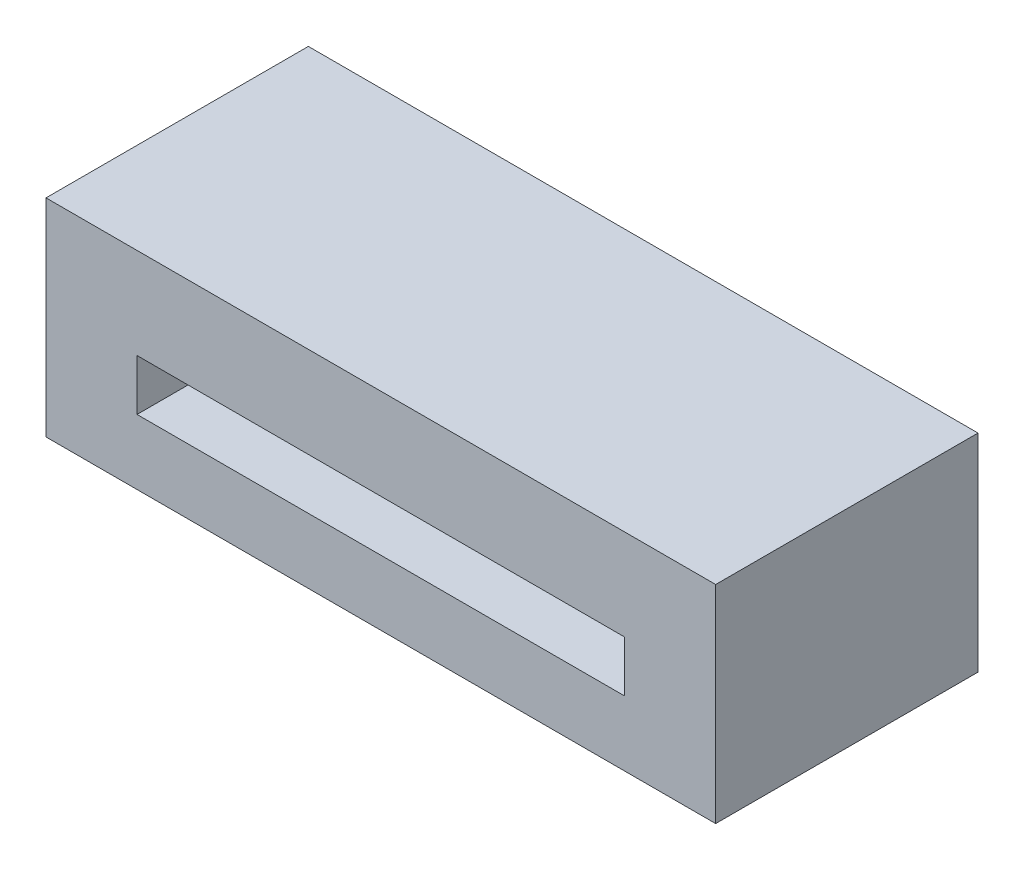
ISO-10303-21;
HEADER;
FILE_DESCRIPTION(('STEP AP214'),'2;1');
FILE_NAME('part.step','',(''),(''),'','','');
FILE_SCHEMA(('AUTOMOTIVE_DESIGN { 1 0 10303 214 1 1 1 1 }'));
ENDSEC;
DATA;
#1=APPLICATION_CONTEXT('core data for automotive mechanical design processes');
#2=APPLICATION_PROTOCOL_DEFINITION('international standard','automotive_design',2000,#1);
#3=PRODUCT_CONTEXT('',#1,'mechanical');
#4=PRODUCT('Part','Part','',(#3));
#5=PRODUCT_RELATED_PRODUCT_CATEGORY('part','',(#4));
#6=PRODUCT_DEFINITION_FORMATION('','',#4);
#7=PRODUCT_DEFINITION_CONTEXT('part definition',#1,'design');
#8=PRODUCT_DEFINITION('design','',#6,#7);
#9=PRODUCT_DEFINITION_SHAPE('','',#8);
#10=(LENGTH_UNIT() NAMED_UNIT(*) SI_UNIT(.MILLI.,.METRE.));
#11=(NAMED_UNIT(*) PLANE_ANGLE_UNIT() SI_UNIT($,.RADIAN.));
#12=(NAMED_UNIT(*) SI_UNIT($,.STERADIAN.) SOLID_ANGLE_UNIT());
#13=UNCERTAINTY_MEASURE_WITH_UNIT(LENGTH_MEASURE(1.E-05),#10,'distance_accuracy_value','');
#14=(GEOMETRIC_REPRESENTATION_CONTEXT(3) GLOBAL_UNCERTAINTY_ASSIGNED_CONTEXT((#13)) GLOBAL_UNIT_ASSIGNED_CONTEXT((#10,
#11,#12)) REPRESENTATION_CONTEXT('',''));
#15=CARTESIAN_POINT('',(0.,0.,0.));
#16=DIRECTION('',(0.,0.,1.));
#17=DIRECTION('',(1.,0.,0.));
#18=AXIS2_PLACEMENT_3D('',#15,#16,#17);
#19=CARTESIAN_POINT('',(0.,-3.57,0.));
#20=DIRECTION('',(0.,1.,0.));
#21=DIRECTION('',(0.,0.,1.));
#22=AXIS2_PLACEMENT_3D('',#19,#20,#21);
#23=PLANE('',#22);
#24=DIRECTION('',(-1.,0.,0.));
#25=VECTOR('',#24,1.);
#26=CARTESIAN_POINT('',(0.,-3.57,-8.07));
#27=LINE('',#26,#25);
#28=CARTESIAN_POINT('',(17.8,-3.57,-8.07));
#29=VERTEX_POINT('',#28);
#30=CARTESIAN_POINT('',(-2.80000000000005,-3.57,-8.07));
#31=VERTEX_POINT('',#30);
#32=EDGE_CURVE('E177',#29,#31,#27,.T.);
#33=ORIENTED_EDGE('',*,*,#32,.F.);
#34=DIRECTION('',(0.,0.,-1.));
#35=VECTOR('',#34,1.);
#36=CARTESIAN_POINT('',(17.8,-3.57,-8.07));
#37=LINE('',#36,#35);
#38=CARTESIAN_POINT('',(17.8000000000001,-3.57,0.));
#39=VERTEX_POINT('',#38);
#40=EDGE_CURVE('E161',#39,#29,#37,.T.);
#41=ORIENTED_EDGE('',*,*,#40,.F.);
#42=DIRECTION('',(1.,0.,0.));
#43=VECTOR('',#42,1.);
#44=CARTESIAN_POINT('',(-2.80000000000006,-3.57,0.));
#45=LINE('',#44,#43);
#46=CARTESIAN_POINT('',(-2.80000000000006,-3.57,0.));
#47=VERTEX_POINT('',#46);
#48=EDGE_CURVE('E183',#47,#39,#45,.T.);
#49=ORIENTED_EDGE('',*,*,#48,.F.);
#50=DIRECTION('',(0.,0.,1.));
#51=VECTOR('',#50,1.);
#52=CARTESIAN_POINT('',(-2.80000000000005,-3.57,-8.07));
#53=LINE('',#52,#51);
#54=EDGE_CURVE('E180',#31,#47,#53,.T.);
#55=ORIENTED_EDGE('',*,*,#54,.F.);
#56=EDGE_LOOP('',(#33,#41,#49,#55));
#57=FACE_BOUND('',#56,.T.);
#58=DIRECTION('',(1.,0.,0.));
#59=VECTOR('',#58,1.);
#60=CARTESIAN_POINT('',(0.,-3.57,-3.60886850650799));
#61=LINE('',#60,#59);
#62=CARTESIAN_POINT('',(6.405,-3.57,-3.60886850650793));
#63=VERTEX_POINT('',#62);
#64=CARTESIAN_POINT('',(8.90499999999999,-3.57,-3.60886850650791));
#65=VERTEX_POINT('',#64);
#66=EDGE_CURVE('E50',#63,#65,#61,.T.);
#67=ORIENTED_EDGE('',*,*,#66,.T.);
#68=DIRECTION('',(0.,0.,-1.));
#69=VECTOR('',#68,1.);
#70=CARTESIAN_POINT('',(8.90499999999999,-3.57,0.));
#71=LINE('',#70,#69);
#72=CARTESIAN_POINT('',(8.90499999999999,-3.57,-7.55386850650791));
#73=VERTEX_POINT('',#72);
#74=EDGE_CURVE('E140',#65,#73,#71,.T.);
#75=ORIENTED_EDGE('',*,*,#74,.T.);
#76=DIRECTION('',(-1.,0.,0.));
#77=VECTOR('',#76,1.);
#78=CARTESIAN_POINT('',(0.,-3.57,-7.55386850650791));
#79=LINE('',#78,#77);
#80=CARTESIAN_POINT('',(6.405,-3.57,-7.55386850650791));
#81=VERTEX_POINT('',#80);
#82=EDGE_CURVE('E126',#73,#81,#79,.T.);
#83=ORIENTED_EDGE('',*,*,#82,.T.);
#84=DIRECTION('',(0.,0.,1.));
#85=VECTOR('',#84,1.);
#86=CARTESIAN_POINT('',(6.405,-3.57,0.));
#87=LINE('',#86,#85);
#88=EDGE_CURVE('E135',#81,#63,#87,.T.);
#89=ORIENTED_EDGE('',*,*,#88,.T.);
#90=EDGE_LOOP('',(#67,#75,#83,#89));
#91=FACE_BOUND('',#90,.T.);
#92=ADVANCED_FACE('F35',(#57,#91),#23,.F.);
#93=CARTESIAN_POINT('',(15.,-1.57,0.));
#94=DIRECTION('',(0.,-1.,0.));
#95=DIRECTION('',(0.,0.,-1.));
#96=AXIS2_PLACEMENT_3D('',#93,#94,#95);
#97=PLANE('',#96);
#98=DIRECTION('',(0.,0.,1.));
#99=VECTOR('',#98,1.);
#100=CARTESIAN_POINT('',(0.,-1.57,0.));
#101=LINE('',#100,#99);
#102=CARTESIAN_POINT('',(0.,-1.57,-8.07));
#103=VERTEX_POINT('',#102);
#104=CARTESIAN_POINT('',(0.,-1.57,0.));
#105=VERTEX_POINT('',#104);
#106=EDGE_CURVE('E147',#103,#105,#101,.T.);
#107=ORIENTED_EDGE('',*,*,#106,.T.);
#108=DIRECTION('',(-1.,0.,0.));
#109=VECTOR('',#108,1.);
#110=CARTESIAN_POINT('',(15.,-1.57,0.));
#111=LINE('',#110,#109);
#112=CARTESIAN_POINT('',(15.,-1.57,0.));
#113=VERTEX_POINT('',#112);
#114=EDGE_CURVE('E157',#113,#105,#111,.T.);
#115=ORIENTED_EDGE('',*,*,#114,.F.);
#116=DIRECTION('',(0.,0.,1.));
#117=VECTOR('',#116,1.);
#118=CARTESIAN_POINT('',(15.,-1.57,0.));
#119=LINE('',#118,#117);
#120=CARTESIAN_POINT('',(15.,-1.57,-8.07));
#121=VERTEX_POINT('',#120);
#122=EDGE_CURVE('E150',#121,#113,#119,.T.);
#123=ORIENTED_EDGE('',*,*,#122,.F.);
#124=DIRECTION('',(-1.,0.,0.));
#125=VECTOR('',#124,1.);
#126=CARTESIAN_POINT('',(15.,-1.57,-8.07));
#127=LINE('',#126,#125);
#128=EDGE_CURVE('E152',#121,#103,#127,.T.);
#129=ORIENTED_EDGE('',*,*,#128,.T.);
#130=EDGE_LOOP('',(#107,#115,#123,#129));
#131=FACE_BOUND('',#130,.T.);
#132=DIRECTION('',(1.,0.,0.));
#133=VECTOR('',#132,1.);
#134=CARTESIAN_POINT('',(15.,-1.57,-3.60886850650785));
#135=LINE('',#134,#133);
#136=CARTESIAN_POINT('',(6.405,-1.57,-3.60886850650793));
#137=VERTEX_POINT('',#136);
#138=CARTESIAN_POINT('',(8.90499999999999,-1.57,-3.60886850650791));
#139=VERTEX_POINT('',#138);
#140=EDGE_CURVE('E11',#137,#139,#135,.T.);
#141=ORIENTED_EDGE('',*,*,#140,.F.);
#142=DIRECTION('',(0.,0.,1.));
#143=VECTOR('',#142,1.);
#144=CARTESIAN_POINT('',(6.405,-1.57,0.));
#145=LINE('',#144,#143);
#146=CARTESIAN_POINT('',(6.405,-1.57,-7.55386850650791));
#147=VERTEX_POINT('',#146);
#148=EDGE_CURVE('E203',#147,#137,#145,.T.);
#149=ORIENTED_EDGE('',*,*,#148,.F.);
#150=DIRECTION('',(-1.,0.,0.));
#151=VECTOR('',#150,1.);
#152=CARTESIAN_POINT('',(15.,-1.57,-7.55386850650791));
#153=LINE('',#152,#151);
#154=CARTESIAN_POINT('',(8.90499999999999,-1.57,-7.55386850650791));
#155=VERTEX_POINT('',#154);
#156=EDGE_CURVE('E129',#155,#147,#153,.T.);
#157=ORIENTED_EDGE('',*,*,#156,.F.);
#158=DIRECTION('',(0.,0.,-1.));
#159=VECTOR('',#158,1.);
#160=CARTESIAN_POINT('',(8.90499999999999,-1.57,0.));
#161=LINE('',#160,#159);
#162=EDGE_CURVE('E43',#139,#155,#161,.T.);
#163=ORIENTED_EDGE('',*,*,#162,.F.);
#164=EDGE_LOOP('',(#141,#149,#157,#163));
#165=FACE_BOUND('',#164,.T.);
#166=ADVANCED_FACE('F221',(#131,#165),#97,.F.);
#167=CARTESIAN_POINT('',(0.,-3.57,0.));
#168=DIRECTION('',(1.,0.,0.));
#169=DIRECTION('',(0.,0.,-1.));
#170=AXIS2_PLACEMENT_3D('',#167,#168,#169);
#171=PLANE('',#170);
#172=DIRECTION('',(0.,1.,0.));
#173=VECTOR('',#172,1.);
#174=CARTESIAN_POINT('',(0.,-3.57,0.));
#175=LINE('',#174,#173);
#176=CARTESIAN_POINT('',(0.,0.,0.));
#177=VERTEX_POINT('',#176);
#178=EDGE_CURVE('E188',#105,#177,#175,.T.);
#179=ORIENTED_EDGE('',*,*,#178,.F.);
#180=ORIENTED_EDGE('',*,*,#106,.F.);
#181=DIRECTION('',(0.,1.,0.));
#182=VECTOR('',#181,1.);
#183=CARTESIAN_POINT('',(0.,-3.57,-8.07));
#184=LINE('',#183,#182);
#185=CARTESIAN_POINT('',(0.,0.,-8.07));
#186=VERTEX_POINT('',#185);
#187=EDGE_CURVE('E185',#103,#186,#184,.T.);
#188=ORIENTED_EDGE('',*,*,#187,.T.);
#189=DIRECTION('',(0.,0.,1.));
#190=VECTOR('',#189,1.);
#191=CARTESIAN_POINT('',(0.,0.,0.));
#192=LINE('',#191,#190);
#193=EDGE_CURVE('E190',#186,#177,#192,.T.);
#194=ORIENTED_EDGE('',*,*,#193,.T.);
#195=EDGE_LOOP('',(#179,#180,#188,#194));
#196=FACE_BOUND('',#195,.T.);
#197=ADVANCED_FACE('F242',(#196),#171,.T.);
#198=CARTESIAN_POINT('',(15.,-3.57,0.));
#199=DIRECTION('',(-1.,0.,0.));
#200=DIRECTION('',(0.,0.,1.));
#201=AXIS2_PLACEMENT_3D('',#198,#199,#200);
#202=PLANE('',#201);
#203=DIRECTION('',(0.,1.,0.));
#204=VECTOR('',#203,1.);
#205=CARTESIAN_POINT('',(15.,-3.57,-8.07));
#206=LINE('',#205,#204);
#207=CARTESIAN_POINT('',(15.,0.,-8.07));
#208=VERTEX_POINT('',#207);
#209=EDGE_CURVE('E170',#121,#208,#206,.T.);
#210=ORIENTED_EDGE('',*,*,#209,.F.);
#211=ORIENTED_EDGE('',*,*,#122,.T.);
#212=DIRECTION('',(0.,1.,0.));
#213=VECTOR('',#212,1.);
#214=CARTESIAN_POINT('',(15.,-3.57,0.));
#215=LINE('',#214,#213);
#216=CARTESIAN_POINT('',(15.,0.,0.));
#217=VERTEX_POINT('',#216);
#218=EDGE_CURVE('E167',#113,#217,#215,.T.);
#219=ORIENTED_EDGE('',*,*,#218,.T.);
#220=DIRECTION('',(0.,0.,-1.));
#221=VECTOR('',#220,1.);
#222=CARTESIAN_POINT('',(15.,0.,0.));
#223=LINE('',#222,#221);
#224=EDGE_CURVE('E209',#217,#208,#223,.T.);
#225=ORIENTED_EDGE('',*,*,#224,.T.);
#226=EDGE_LOOP('',(#210,#211,#219,#225));
#227=FACE_BOUND('',#226,.T.);
#228=ADVANCED_FACE('F252',(#227),#202,.T.);
#229=CARTESIAN_POINT('',(0.,2.8,0.));
#230=DIRECTION('',(0.,0.,-1.));
#231=DIRECTION('',(-1.,0.,0.));
#232=AXIS2_PLACEMENT_3D('',#229,#230,#231);
#233=PLANE('',#232);
#234=ORIENTED_EDGE('',*,*,#114,.T.);
#235=ORIENTED_EDGE('',*,*,#178,.T.);
#236=DIRECTION('',(1.,0.,0.));
#237=VECTOR('',#236,1.);
#238=CARTESIAN_POINT('',(0.,0.,0.));
#239=LINE('',#238,#237);
#240=EDGE_CURVE('E206',#177,#217,#239,.T.);
#241=ORIENTED_EDGE('',*,*,#240,.T.);
#242=ORIENTED_EDGE('',*,*,#218,.F.);
#243=EDGE_LOOP('',(#234,#235,#241,#242));
#244=FACE_BOUND('',#243,.T.);
#245=ORIENTED_EDGE('',*,*,#48,.T.);
#246=DIRECTION('',(0.,1.,0.));
#247=VECTOR('',#246,1.);
#248=CARTESIAN_POINT('',(17.8000000000001,-3.57,0.));
#249=LINE('',#248,#247);
#250=CARTESIAN_POINT('',(17.8000000000001,2.8,0.));
#251=VERTEX_POINT('',#250);
#252=EDGE_CURVE('E164',#39,#251,#249,.T.);
#253=ORIENTED_EDGE('',*,*,#252,.T.);
#254=DIRECTION('',(1.,0.,0.));
#255=VECTOR('',#254,1.);
#256=CARTESIAN_POINT('',(0.,2.8,0.));
#257=LINE('',#256,#255);
#258=CARTESIAN_POINT('',(-2.80000000000006,2.8,0.));
#259=VERTEX_POINT('',#258);
#260=EDGE_CURVE('E198',#259,#251,#257,.T.);
#261=ORIENTED_EDGE('',*,*,#260,.F.);
#262=DIRECTION('',(0.,1.,0.));
#263=VECTOR('',#262,1.);
#264=CARTESIAN_POINT('',(-2.80000000000006,-3.57,0.));
#265=LINE('',#264,#263);
#266=EDGE_CURVE('E191',#47,#259,#265,.T.);
#267=ORIENTED_EDGE('',*,*,#266,.F.);
#268=EDGE_LOOP('',(#245,#253,#261,#267));
#269=FACE_BOUND('',#268,.T.);
#270=ADVANCED_FACE('F37',(#244,#269),#233,.F.);
#271=CARTESIAN_POINT('',(0.,2.8,-8.07));
#272=DIRECTION('',(0.,0.,1.));
#273=DIRECTION('',(1.,0.,0.));
#274=AXIS2_PLACEMENT_3D('',#271,#272,#273);
#275=PLANE('',#274);
#276=ORIENTED_EDGE('',*,*,#187,.F.);
#277=ORIENTED_EDGE('',*,*,#128,.F.);
#278=ORIENTED_EDGE('',*,*,#209,.T.);
#279=DIRECTION('',(-1.,0.,0.));
#280=VECTOR('',#279,1.);
#281=CARTESIAN_POINT('',(0.,0.,-8.07));
#282=LINE('',#281,#280);
#283=EDGE_CURVE('E201',#208,#186,#282,.T.);
#284=ORIENTED_EDGE('',*,*,#283,.T.);
#285=EDGE_LOOP('',(#276,#277,#278,#284));
#286=FACE_BOUND('',#285,.T.);
#287=DIRECTION('',(0.,1.,0.));
#288=VECTOR('',#287,1.);
#289=CARTESIAN_POINT('',(17.8,-3.57,-8.07));
#290=LINE('',#289,#288);
#291=CARTESIAN_POINT('',(17.8,2.8,-8.07));
#292=VERTEX_POINT('',#291);
#293=EDGE_CURVE('E172',#29,#292,#290,.T.);
#294=ORIENTED_EDGE('',*,*,#293,.F.);
#295=ORIENTED_EDGE('',*,*,#32,.T.);
#296=DIRECTION('',(0.,1.,0.));
#297=VECTOR('',#296,1.);
#298=CARTESIAN_POINT('',(-2.80000000000005,-3.57,-8.07));
#299=LINE('',#298,#297);
#300=CARTESIAN_POINT('',(-2.80000000000005,2.8,-8.07));
#301=VERTEX_POINT('',#300);
#302=EDGE_CURVE('E194',#31,#301,#299,.T.);
#303=ORIENTED_EDGE('',*,*,#302,.T.);
#304=DIRECTION('',(-1.,0.,0.));
#305=VECTOR('',#304,1.);
#306=CARTESIAN_POINT('',(0.,2.8,-8.07));
#307=LINE('',#306,#305);
#308=EDGE_CURVE('E200',#292,#301,#307,.T.);
#309=ORIENTED_EDGE('',*,*,#308,.F.);
#310=EDGE_LOOP('',(#294,#295,#303,#309));
#311=FACE_BOUND('',#310,.T.);
#312=ADVANCED_FACE('F257',(#286,#311),#275,.F.);
#313=CARTESIAN_POINT('',(0.,2.8,0.));
#314=DIRECTION('',(0.,-1.,0.));
#315=DIRECTION('',(0.,0.,-1.));
#316=AXIS2_PLACEMENT_3D('',#313,#314,#315);
#317=PLANE('',#316);
#318=ORIENTED_EDGE('',*,*,#308,.T.);
#319=DIRECTION('',(0.,0.,1.));
#320=VECTOR('',#319,1.);
#321=CARTESIAN_POINT('',(-2.80000000000005,2.8,-8.07));
#322=LINE('',#321,#320);
#323=EDGE_CURVE('E169',#301,#259,#322,.T.);
#324=ORIENTED_EDGE('',*,*,#323,.T.);
#325=ORIENTED_EDGE('',*,*,#260,.T.);
#326=DIRECTION('',(0.,0.,-1.));
#327=VECTOR('',#326,1.);
#328=CARTESIAN_POINT('',(17.8,2.8,-8.07));
#329=LINE('',#328,#327);
#330=EDGE_CURVE('E160',#251,#292,#329,.T.);
#331=ORIENTED_EDGE('',*,*,#330,.T.);
#332=EDGE_LOOP('',(#318,#324,#325,#331));
#333=FACE_BOUND('',#332,.T.);
#334=ADVANCED_FACE('F254',(#333),#317,.F.);
#335=CARTESIAN_POINT('',(0.,0.,0.));
#336=DIRECTION('',(0.,-1.,0.));
#337=DIRECTION('',(0.,0.,-1.));
#338=AXIS2_PLACEMENT_3D('',#335,#336,#337);
#339=PLANE('',#338);
#340=ORIENTED_EDGE('',*,*,#193,.F.);
#341=ORIENTED_EDGE('',*,*,#283,.F.);
#342=ORIENTED_EDGE('',*,*,#224,.F.);
#343=ORIENTED_EDGE('',*,*,#240,.F.);
#344=EDGE_LOOP('',(#340,#341,#342,#343));
#345=FACE_BOUND('',#344,.T.);
#346=ADVANCED_FACE('F248',(#345),#339,.T.);
#347=CARTESIAN_POINT('',(-2.80000000000005,-3.57,-8.07));
#348=DIRECTION('',(-1.,0.,0.));
#349=DIRECTION('',(0.,0.,1.));
#350=AXIS2_PLACEMENT_3D('',#347,#348,#349);
#351=PLANE('',#350);
#352=ORIENTED_EDGE('',*,*,#323,.F.);
#353=ORIENTED_EDGE('',*,*,#302,.F.);
#354=ORIENTED_EDGE('',*,*,#54,.T.);
#355=ORIENTED_EDGE('',*,*,#266,.T.);
#356=EDGE_LOOP('',(#352,#353,#354,#355));
#357=FACE_BOUND('',#356,.T.);
#358=ADVANCED_FACE('F231',(#357),#351,.T.);
#359=CARTESIAN_POINT('',(17.8,-3.57,-8.07));
#360=DIRECTION('',(1.,0.,0.));
#361=DIRECTION('',(0.,0.,-1.));
#362=AXIS2_PLACEMENT_3D('',#359,#360,#361);
#363=PLANE('',#362);
#364=ORIENTED_EDGE('',*,*,#330,.F.);
#365=ORIENTED_EDGE('',*,*,#252,.F.);
#366=ORIENTED_EDGE('',*,*,#40,.T.);
#367=ORIENTED_EDGE('',*,*,#293,.T.);
#368=EDGE_LOOP('',(#364,#365,#366,#367));
#369=FACE_BOUND('',#368,.T.);
#370=ADVANCED_FACE('F224',(#369),#363,.T.);
#371=CARTESIAN_POINT('',(0.,-0.570000000000008,-3.60886850650799));
#372=DIRECTION('',(0.,0.,-1.));
#373=DIRECTION('',(-1.,0.,0.));
#374=AXIS2_PLACEMENT_3D('',#371,#372,#373);
#375=PLANE('',#374);
#376=ORIENTED_EDGE('',*,*,#140,.T.);
#377=DIRECTION('',(0.,-1.,0.));
#378=VECTOR('',#377,1.);
#379=CARTESIAN_POINT('',(8.90499999999999,-0.570000000000008,-3.60886850650791));
#380=LINE('',#379,#378);
#381=EDGE_CURVE('E145',#139,#65,#380,.T.);
#382=ORIENTED_EDGE('',*,*,#381,.T.);
#383=ORIENTED_EDGE('',*,*,#66,.F.);
#384=DIRECTION('',(0.,-1.,0.));
#385=VECTOR('',#384,1.);
#386=CARTESIAN_POINT('',(6.405,-0.570000000000008,-3.60886850650793));
#387=LINE('',#386,#385);
#388=EDGE_CURVE('E132',#137,#63,#387,.T.);
#389=ORIENTED_EDGE('',*,*,#388,.F.);
#390=EDGE_LOOP('',(#376,#382,#383,#389));
#391=FACE_BOUND('',#390,.T.);
#392=ADVANCED_FACE('F222',(#391),#375,.T.);
#393=CARTESIAN_POINT('',(8.90499999999999,-0.570000000000008,0.));
#394=DIRECTION('',(-1.,0.,0.));
#395=DIRECTION('',(0.,0.,1.));
#396=AXIS2_PLACEMENT_3D('',#393,#394,#395);
#397=PLANE('',#396);
#398=ORIENTED_EDGE('',*,*,#162,.T.);
#399=DIRECTION('',(0.,-1.,0.));
#400=VECTOR('',#399,1.);
#401=CARTESIAN_POINT('',(8.90499999999999,-0.570000000000008,-7.55386850650791));
#402=LINE('',#401,#400);
#403=EDGE_CURVE('E131',#155,#73,#402,.T.);
#404=ORIENTED_EDGE('',*,*,#403,.T.);
#405=ORIENTED_EDGE('',*,*,#74,.F.);
#406=ORIENTED_EDGE('',*,*,#381,.F.);
#407=EDGE_LOOP('',(#398,#404,#405,#406));
#408=FACE_BOUND('',#407,.T.);
#409=ADVANCED_FACE('F218',(#408),#397,.T.);
#410=CARTESIAN_POINT('',(0.,-0.570000000000008,-7.55386850650791));
#411=DIRECTION('',(0.,0.,1.));
#412=DIRECTION('',(1.,0.,0.));
#413=AXIS2_PLACEMENT_3D('',#410,#411,#412);
#414=PLANE('',#413);
#415=ORIENTED_EDGE('',*,*,#156,.T.);
#416=DIRECTION('',(0.,-1.,0.));
#417=VECTOR('',#416,1.);
#418=CARTESIAN_POINT('',(6.405,-0.570000000000008,-7.55386850650791));
#419=LINE('',#418,#417);
#420=EDGE_CURVE('E58',#147,#81,#419,.T.);
#421=ORIENTED_EDGE('',*,*,#420,.T.);
#422=ORIENTED_EDGE('',*,*,#82,.F.);
#423=ORIENTED_EDGE('',*,*,#403,.F.);
#424=EDGE_LOOP('',(#415,#421,#422,#423));
#425=FACE_BOUND('',#424,.T.);
#426=ADVANCED_FACE('F123',(#425),#414,.T.);
#427=CARTESIAN_POINT('',(6.405,-0.570000000000008,0.));
#428=DIRECTION('',(1.,0.,0.));
#429=DIRECTION('',(0.,0.,-1.));
#430=AXIS2_PLACEMENT_3D('',#427,#428,#429);
#431=PLANE('',#430);
#432=ORIENTED_EDGE('',*,*,#148,.T.);
#433=ORIENTED_EDGE('',*,*,#388,.T.);
#434=ORIENTED_EDGE('',*,*,#88,.F.);
#435=ORIENTED_EDGE('',*,*,#420,.F.);
#436=EDGE_LOOP('',(#432,#433,#434,#435));
#437=FACE_BOUND('',#436,.T.);
#438=ADVANCED_FACE('F136',(#437),#431,.T.);
#439=CLOSED_SHELL('',(#92,#166,#197,#228,#270,#312,#334,#346,#358,#370,#392,#409,#426,#438));
#440=MANIFOLD_SOLID_BREP('B2',#439);
#441=ADVANCED_BREP_SHAPE_REPRESENTATION('',(#18,#440),#14);
#442=SHAPE_DEFINITION_REPRESENTATION(#9,#441);
ENDSEC;
END-ISO-10303-21;
